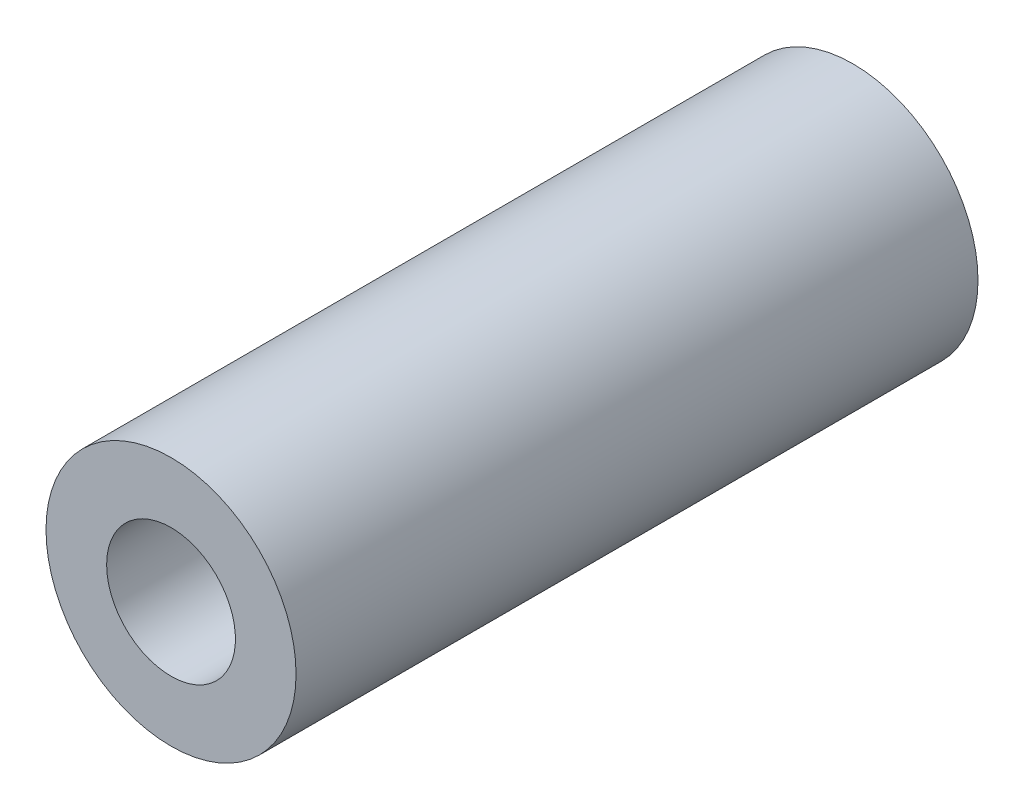
ISO-10303-21;
HEADER;
FILE_DESCRIPTION(('STEP AP214'),'2;1');
FILE_NAME('part.step','',(''),(''),'','','');
FILE_SCHEMA(('AUTOMOTIVE_DESIGN { 1 0 10303 214 1 1 1 1 }'));
ENDSEC;
DATA;
#1=APPLICATION_CONTEXT('core data for automotive mechanical design processes');
#2=APPLICATION_PROTOCOL_DEFINITION('international standard','automotive_design',2000,#1);
#3=PRODUCT_CONTEXT('',#1,'mechanical');
#4=PRODUCT('Part','Part','',(#3));
#5=PRODUCT_RELATED_PRODUCT_CATEGORY('part','',(#4));
#6=PRODUCT_DEFINITION_FORMATION('','',#4);
#7=PRODUCT_DEFINITION_CONTEXT('part definition',#1,'design');
#8=PRODUCT_DEFINITION('design','',#6,#7);
#9=PRODUCT_DEFINITION_SHAPE('','',#8);
#10=(LENGTH_UNIT() NAMED_UNIT(*) SI_UNIT(.MILLI.,.METRE.));
#11=(NAMED_UNIT(*) PLANE_ANGLE_UNIT() SI_UNIT($,.RADIAN.));
#12=(NAMED_UNIT(*) SI_UNIT($,.STERADIAN.) SOLID_ANGLE_UNIT());
#13=UNCERTAINTY_MEASURE_WITH_UNIT(LENGTH_MEASURE(1.E-05),#10,'distance_accuracy_value','');
#14=(GEOMETRIC_REPRESENTATION_CONTEXT(3) GLOBAL_UNCERTAINTY_ASSIGNED_CONTEXT((#13)) GLOBAL_UNIT_ASSIGNED_CONTEXT((#10,
#11,#12)) REPRESENTATION_CONTEXT('',''));
#15=CARTESIAN_POINT('',(0.,0.,0.));
#16=DIRECTION('',(0.,0.,1.));
#17=DIRECTION('',(1.,0.,0.));
#18=AXIS2_PLACEMENT_3D('',#15,#16,#17);
#19=CARTESIAN_POINT('',(0.,0.,22.5));
#20=DIRECTION('',(0.,0.,1.));
#21=DIRECTION('',(1.,0.,0.));
#22=AXIS2_PLACEMENT_3D('',#19,#20,#21);
#23=PLANE('',#22);
#24=CARTESIAN_POINT('',(0.,0.,22.5));
#25=DIRECTION('',(0.,0.,1.));
#26=DIRECTION('',(1.,0.,0.));
#27=AXIS2_PLACEMENT_3D('',#24,#25,#26);
#28=CIRCLE('',#27,8.25);
#29=CARTESIAN_POINT('',(-8.25,0.,22.5));
#30=VERTEX_POINT('',#29);
#31=EDGE_CURVE('E10',#30,#30,#28,.T.);
#32=ORIENTED_EDGE('',*,*,#31,.T.);
#33=EDGE_LOOP('',(#32));
#34=FACE_BOUND('',#33,.T.);
#35=CARTESIAN_POINT('',(0.,0.,22.5));
#36=DIRECTION('',(0.,0.,1.));
#37=DIRECTION('',(1.,0.,0.));
#38=AXIS2_PLACEMENT_3D('',#35,#36,#37);
#39=CIRCLE('',#38,4.25);
#40=CARTESIAN_POINT('',(-4.25,0.,22.5));
#41=VERTEX_POINT('',#40);
#42=EDGE_CURVE('E46',#41,#41,#39,.T.);
#43=ORIENTED_EDGE('',*,*,#42,.F.);
#44=EDGE_LOOP('',(#43));
#45=FACE_BOUND('',#44,.T.);
#46=ADVANCED_FACE('F35',(#34,#45),#23,.T.);
#47=CARTESIAN_POINT('',(0.,0.,-22.5));
#48=DIRECTION('',(0.,0.,1.));
#49=DIRECTION('',(1.,0.,0.));
#50=AXIS2_PLACEMENT_3D('',#47,#48,#49);
#51=PLANE('',#50);
#52=CARTESIAN_POINT('',(0.,0.,-22.5));
#53=DIRECTION('',(0.,0.,1.));
#54=DIRECTION('',(1.,0.,0.));
#55=AXIS2_PLACEMENT_3D('',#52,#53,#54);
#56=CIRCLE('',#55,8.25);
#57=CARTESIAN_POINT('',(-8.25,0.,-22.5));
#58=VERTEX_POINT('',#57);
#59=EDGE_CURVE('E39',#58,#58,#56,.T.);
#60=ORIENTED_EDGE('',*,*,#59,.F.);
#61=EDGE_LOOP('',(#60));
#62=FACE_BOUND('',#61,.T.);
#63=CARTESIAN_POINT('',(0.,0.,-22.5));
#64=DIRECTION('',(0.,0.,1.));
#65=DIRECTION('',(1.,0.,0.));
#66=AXIS2_PLACEMENT_3D('',#63,#64,#65);
#67=CIRCLE('',#66,4.25);
#68=CARTESIAN_POINT('',(-4.25,0.,-22.5));
#69=VERTEX_POINT('',#68);
#70=EDGE_CURVE('E48',#69,#69,#67,.T.);
#71=ORIENTED_EDGE('',*,*,#70,.T.);
#72=EDGE_LOOP('',(#71));
#73=FACE_BOUND('',#72,.T.);
#74=ADVANCED_FACE('F58',(#62,#73),#51,.F.);
#75=CARTESIAN_POINT('',(0.,0.,22.5));
#76=DIRECTION('',(0.,0.,-1.));
#77=DIRECTION('',(-1.,0.,0.));
#78=AXIS2_PLACEMENT_3D('',#75,#76,#77);
#79=CYLINDRICAL_SURFACE('',#78,8.25);
#80=CARTESIAN_POINT('',(-8.25,0.,22.5));
#81=CARTESIAN_POINT('',(-8.25,0.,22.03125));
#82=CARTESIAN_POINT('',(-8.25,0.,21.5625));
#83=CARTESIAN_POINT('',(-8.25,0.,20.625));
#84=CARTESIAN_POINT('',(-8.25,0.,20.15625));
#85=CARTESIAN_POINT('',(-8.25,0.,19.21875));
#86=CARTESIAN_POINT('',(-8.25,0.,18.75));
#87=CARTESIAN_POINT('',(-8.25,0.,17.8125));
#88=CARTESIAN_POINT('',(-8.25,0.,17.34375));
#89=CARTESIAN_POINT('',(-8.25,0.,16.40625));
#90=CARTESIAN_POINT('',(-8.25,0.,15.9375));
#91=CARTESIAN_POINT('',(-8.25,0.,15.));
#92=CARTESIAN_POINT('',(-8.25,0.,14.53125));
#93=CARTESIAN_POINT('',(-8.25,0.,13.59375));
#94=CARTESIAN_POINT('',(-8.25,0.,13.125));
#95=CARTESIAN_POINT('',(-8.25,0.,12.1875));
#96=CARTESIAN_POINT('',(-8.25,0.,11.71875));
#97=CARTESIAN_POINT('',(-8.25,0.,10.78125));
#98=CARTESIAN_POINT('',(-8.25,0.,10.3125));
#99=CARTESIAN_POINT('',(-8.25,0.,9.37499999999999));
#100=CARTESIAN_POINT('',(-8.25,0.,8.90625));
#101=CARTESIAN_POINT('',(-8.25,0.,7.96874999999999));
#102=CARTESIAN_POINT('',(-8.25,0.,7.5));
#103=CARTESIAN_POINT('',(-8.25,0.,6.5625));
#104=CARTESIAN_POINT('',(-8.25,0.,6.09374999999999));
#105=CARTESIAN_POINT('',(-8.25,0.,5.15624999999999));
#106=CARTESIAN_POINT('',(-8.25,0.,4.68749999999999));
#107=CARTESIAN_POINT('',(-8.25,0.,3.74999999999999));
#108=CARTESIAN_POINT('',(-8.25,0.,3.28124999999999));
#109=CARTESIAN_POINT('',(-8.25,0.,2.34375));
#110=CARTESIAN_POINT('',(-8.25,0.,1.87499999999999));
#111=CARTESIAN_POINT('',(-8.25,0.,0.937499999999994));
#112=CARTESIAN_POINT('',(-8.25,0.,0.468749999999993));
#113=CARTESIAN_POINT('',(-8.25,0.,-0.468750000000007));
#114=CARTESIAN_POINT('',(-8.25,0.,-0.937500000000008));
#115=CARTESIAN_POINT('',(-8.25,0.,-1.87500000000001));
#116=CARTESIAN_POINT('',(-8.25,0.,-2.34375000000001));
#117=CARTESIAN_POINT('',(-8.25,0.,-3.28125000000001));
#118=CARTESIAN_POINT('',(-8.25,0.,-3.75000000000001));
#119=CARTESIAN_POINT('',(-8.25,0.,-4.68750000000001));
#120=CARTESIAN_POINT('',(-8.25,0.,-5.15625000000001));
#121=CARTESIAN_POINT('',(-8.25,0.,-6.09375000000001));
#122=CARTESIAN_POINT('',(-8.25,0.,-6.56250000000001));
#123=CARTESIAN_POINT('',(-8.25,0.,-7.50000000000001));
#124=CARTESIAN_POINT('',(-8.25,0.,-7.96875000000001));
#125=CARTESIAN_POINT('',(-8.25,0.,-8.90625000000001));
#126=CARTESIAN_POINT('',(-8.25,0.,-9.37500000000001));
#127=CARTESIAN_POINT('',(-8.25,0.,-10.3125));
#128=CARTESIAN_POINT('',(-8.25,0.,-10.78125));
#129=CARTESIAN_POINT('',(-8.25,0.,-11.71875));
#130=CARTESIAN_POINT('',(-8.25,0.,-12.1875));
#131=CARTESIAN_POINT('',(-8.25,0.,-13.125));
#132=CARTESIAN_POINT('',(-8.25,0.,-13.59375));
#133=CARTESIAN_POINT('',(-8.25,0.,-14.53125));
#134=CARTESIAN_POINT('',(-8.25,0.,-15.));
#135=CARTESIAN_POINT('',(-8.25,0.,-15.9375));
#136=CARTESIAN_POINT('',(-8.25,0.,-16.40625));
#137=CARTESIAN_POINT('',(-8.25,0.,-17.34375));
#138=CARTESIAN_POINT('',(-8.25,0.,-17.8125));
#139=CARTESIAN_POINT('',(-8.25,0.,-18.75));
#140=CARTESIAN_POINT('',(-8.25,0.,-19.21875));
#141=CARTESIAN_POINT('',(-8.25,0.,-20.15625));
#142=CARTESIAN_POINT('',(-8.25,0.,-20.625));
#143=CARTESIAN_POINT('',(-8.25,0.,-21.5625));
#144=CARTESIAN_POINT('',(-8.25,0.,-22.03125));
#145=CARTESIAN_POINT('',(-8.25,0.,-22.5));
#146=B_SPLINE_CURVE_WITH_KNOTS('',3,(#80,#81,#82,#83,#84,#85,#86,#87,#88,#89,#90,#91,#92,#93,
#94,#95,#96,#97,#98,#99,#100,#101,#102,#103,#104,#105,#106,#107,#108,#109,#110,#111,#112,#113,
#114,#115,#116,#117,#118,#119,#120,#121,#122,#123,#124,#125,#126,#127,#128,#129,#130,#131,#132,
#133,#134,#135,#136,#137,#138,#139,#140,#141,#142,#143,#144,#145),.UNSPECIFIED.,.F.,.F.,(4,2,2,
2,2,2,2,2,2,2,2,2,2,2,2,2,2,2,2,2,2,2,2,2,2,2,2,2,2,2,2,2,4),(0.,1.40625,2.8125,4.21875,5.625,
7.03125,8.4375,9.84375,11.25,12.65625,14.0625,15.46875,16.875,18.28125,19.6875,21.09375,22.5,
23.90625,25.3125,26.71875,28.125,29.53125,30.9375,32.34375,33.75,35.15625,36.5625,37.96875,
39.375,40.78125,42.1875,43.59375,45.),.UNSPECIFIED.);
#147=EDGE_CURVE('BSEAM37',#30,#58,#146,.T.);
#148=ORIENTED_EDGE('',*,*,#31,.F.);
#149=ORIENTED_EDGE('',*,*,#59,.T.);
#150=ORIENTED_EDGE('',*,*,#147,.T.);
#151=ORIENTED_EDGE('',*,*,#147,.F.);
#152=EDGE_LOOP('',(#148,#150,#149,#151));
#153=FACE_BOUND('',#152,.T.);
#154=ADVANCED_FACE('F37',(#153),#79,.T.);
#155=CARTESIAN_POINT('',(0.,0.,22.5));
#156=DIRECTION('',(0.,0.,-1.));
#157=DIRECTION('',(-1.,0.,0.));
#158=AXIS2_PLACEMENT_3D('',#155,#156,#157);
#159=CYLINDRICAL_SURFACE('',#158,4.25);
#160=CARTESIAN_POINT('',(-4.25,0.,22.5));
#161=CARTESIAN_POINT('',(-4.25,0.,22.03125));
#162=CARTESIAN_POINT('',(-4.25,0.,21.5625));
#163=CARTESIAN_POINT('',(-4.25,0.,20.625));
#164=CARTESIAN_POINT('',(-4.25,0.,20.15625));
#165=CARTESIAN_POINT('',(-4.25,0.,19.21875));
#166=CARTESIAN_POINT('',(-4.25,0.,18.75));
#167=CARTESIAN_POINT('',(-4.25,0.,17.8125));
#168=CARTESIAN_POINT('',(-4.25,0.,17.34375));
#169=CARTESIAN_POINT('',(-4.25,0.,16.40625));
#170=CARTESIAN_POINT('',(-4.25,0.,15.9375));
#171=CARTESIAN_POINT('',(-4.25,0.,15.));
#172=CARTESIAN_POINT('',(-4.25,0.,14.53125));
#173=CARTESIAN_POINT('',(-4.25,0.,13.59375));
#174=CARTESIAN_POINT('',(-4.25,0.,13.125));
#175=CARTESIAN_POINT('',(-4.25,0.,12.1875));
#176=CARTESIAN_POINT('',(-4.25,0.,11.71875));
#177=CARTESIAN_POINT('',(-4.25,0.,10.78125));
#178=CARTESIAN_POINT('',(-4.25,0.,10.3125));
#179=CARTESIAN_POINT('',(-4.25,0.,9.37499999999999));
#180=CARTESIAN_POINT('',(-4.25,0.,8.90625));
#181=CARTESIAN_POINT('',(-4.25,0.,7.96874999999999));
#182=CARTESIAN_POINT('',(-4.25,0.,7.5));
#183=CARTESIAN_POINT('',(-4.25,0.,6.5625));
#184=CARTESIAN_POINT('',(-4.25,0.,6.09374999999999));
#185=CARTESIAN_POINT('',(-4.25,0.,5.15624999999999));
#186=CARTESIAN_POINT('',(-4.25,0.,4.68749999999999));
#187=CARTESIAN_POINT('',(-4.25,0.,3.74999999999999));
#188=CARTESIAN_POINT('',(-4.25,0.,3.28124999999999));
#189=CARTESIAN_POINT('',(-4.25,0.,2.34375));
#190=CARTESIAN_POINT('',(-4.25,0.,1.87499999999999));
#191=CARTESIAN_POINT('',(-4.25,0.,0.937499999999994));
#192=CARTESIAN_POINT('',(-4.25,0.,0.468749999999993));
#193=CARTESIAN_POINT('',(-4.25,0.,-0.468750000000007));
#194=CARTESIAN_POINT('',(-4.25,0.,-0.937500000000008));
#195=CARTESIAN_POINT('',(-4.25,0.,-1.87500000000001));
#196=CARTESIAN_POINT('',(-4.25,0.,-2.34375000000001));
#197=CARTESIAN_POINT('',(-4.25,0.,-3.28125000000001));
#198=CARTESIAN_POINT('',(-4.25,0.,-3.75000000000001));
#199=CARTESIAN_POINT('',(-4.25,0.,-4.68750000000001));
#200=CARTESIAN_POINT('',(-4.25,0.,-5.15625000000001));
#201=CARTESIAN_POINT('',(-4.25,0.,-6.09375000000001));
#202=CARTESIAN_POINT('',(-4.25,0.,-6.56250000000001));
#203=CARTESIAN_POINT('',(-4.25,0.,-7.50000000000001));
#204=CARTESIAN_POINT('',(-4.25,0.,-7.96875000000001));
#205=CARTESIAN_POINT('',(-4.25,0.,-8.90625000000001));
#206=CARTESIAN_POINT('',(-4.25,0.,-9.37500000000001));
#207=CARTESIAN_POINT('',(-4.25,0.,-10.3125));
#208=CARTESIAN_POINT('',(-4.25,0.,-10.78125));
#209=CARTESIAN_POINT('',(-4.25,0.,-11.71875));
#210=CARTESIAN_POINT('',(-4.25,0.,-12.1875));
#211=CARTESIAN_POINT('',(-4.25,0.,-13.125));
#212=CARTESIAN_POINT('',(-4.25,0.,-13.59375));
#213=CARTESIAN_POINT('',(-4.25,0.,-14.53125));
#214=CARTESIAN_POINT('',(-4.25,0.,-15.));
#215=CARTESIAN_POINT('',(-4.25,0.,-15.9375));
#216=CARTESIAN_POINT('',(-4.25,0.,-16.40625));
#217=CARTESIAN_POINT('',(-4.25,0.,-17.34375));
#218=CARTESIAN_POINT('',(-4.25,0.,-17.8125));
#219=CARTESIAN_POINT('',(-4.25,0.,-18.75));
#220=CARTESIAN_POINT('',(-4.25,0.,-19.21875));
#221=CARTESIAN_POINT('',(-4.25,0.,-20.15625));
#222=CARTESIAN_POINT('',(-4.25,0.,-20.625));
#223=CARTESIAN_POINT('',(-4.25,0.,-21.5625));
#224=CARTESIAN_POINT('',(-4.25,0.,-22.03125));
#225=CARTESIAN_POINT('',(-4.25,0.,-22.5));
#226=B_SPLINE_CURVE_WITH_KNOTS('',3,(#160,#161,#162,#163,#164,#165,#166,#167,#168,#169,#170,
#171,#172,#173,#174,#175,#176,#177,#178,#179,#180,#181,#182,#183,#184,#185,#186,#187,#188,#189,
#190,#191,#192,#193,#194,#195,#196,#197,#198,#199,#200,#201,#202,#203,#204,#205,#206,#207,#208,
#209,#210,#211,#212,#213,#214,#215,#216,#217,#218,#219,#220,#221,#222,#223,#224,#225),
.UNSPECIFIED.,.F.,.F.,(4,2,2,2,2,2,2,2,2,2,2,2,2,2,2,2,2,2,2,2,2,2,2,2,2,2,2,2,2,2,2,2,4),(0.,
1.40625,2.8125,4.21875,5.625,7.03125,8.4375,9.84375,11.25,12.65625,14.0625,15.46875,16.875,
18.28125,19.6875,21.09375,22.5,23.90625,25.3125,26.71875,28.125,29.53125,30.9375,32.34375,33.75,
35.15625,36.5625,37.96875,39.375,40.78125,42.1875,43.59375,45.),.UNSPECIFIED.);
#227=EDGE_CURVE('BSEAM54',#41,#69,#226,.T.);
#228=ORIENTED_EDGE('',*,*,#42,.T.);
#229=ORIENTED_EDGE('',*,*,#70,.F.);
#230=ORIENTED_EDGE('',*,*,#227,.T.);
#231=ORIENTED_EDGE('',*,*,#227,.F.);
#232=EDGE_LOOP('',(#228,#230,#229,#231));
#233=FACE_BOUND('',#232,.T.);
#234=ADVANCED_FACE('F54',(#233),#159,.F.);
#235=CLOSED_SHELL('',(#46,#74,#154,#234));
#236=MANIFOLD_SOLID_BREP('B2',#235);
#237=ADVANCED_BREP_SHAPE_REPRESENTATION('',(#18,#236),#14);
#238=SHAPE_DEFINITION_REPRESENTATION(#9,#237);
ENDSEC;
END-ISO-10303-21;
